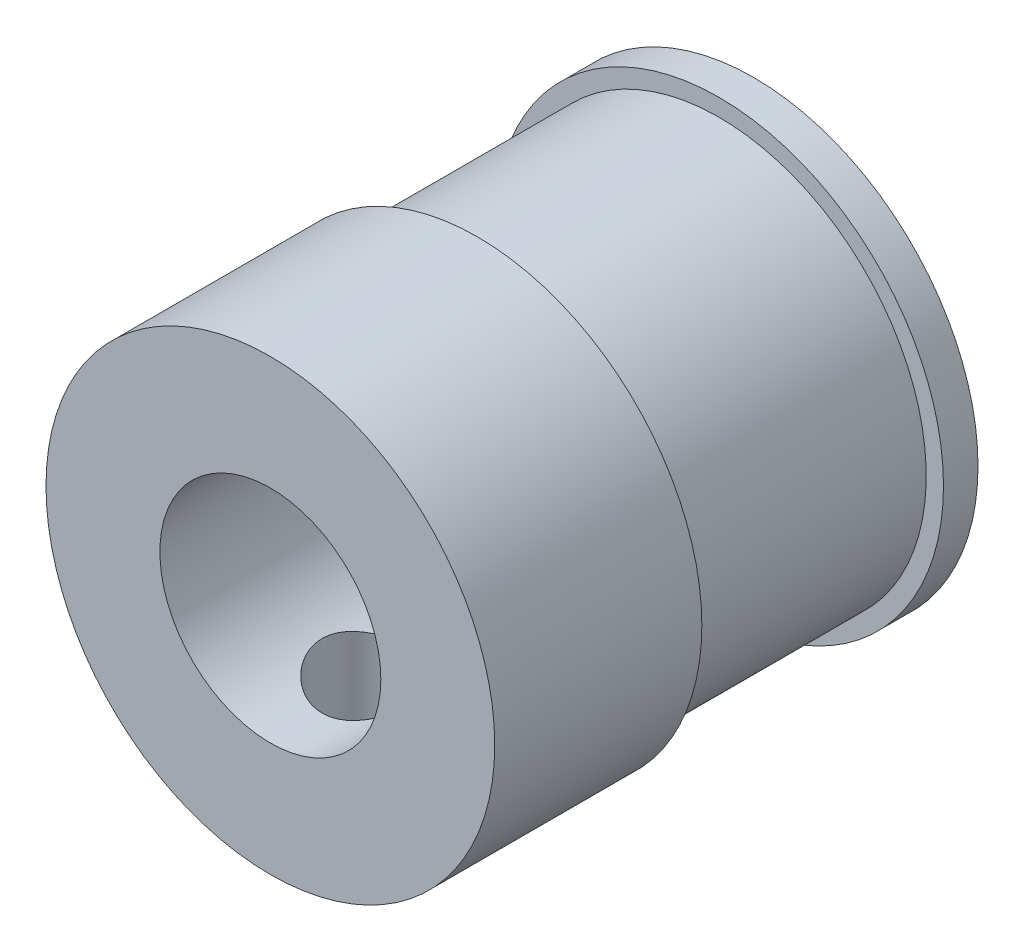
ISO-10303-21;
HEADER;
FILE_DESCRIPTION(('STEP AP214'),'2;1');
FILE_NAME('part.step','',(''),(''),'','','');
FILE_SCHEMA(('AUTOMOTIVE_DESIGN { 1 0 10303 214 1 1 1 1 }'));
ENDSEC;
DATA;
#1=APPLICATION_CONTEXT('core data for automotive mechanical design processes');
#2=APPLICATION_PROTOCOL_DEFINITION('international standard','automotive_design',2000,#1);
#3=PRODUCT_CONTEXT('',#1,'mechanical');
#4=PRODUCT('Part','Part','',(#3));
#5=PRODUCT_RELATED_PRODUCT_CATEGORY('part','',(#4));
#6=PRODUCT_DEFINITION_FORMATION('','',#4);
#7=PRODUCT_DEFINITION_CONTEXT('part definition',#1,'design');
#8=PRODUCT_DEFINITION('design','',#6,#7);
#9=PRODUCT_DEFINITION_SHAPE('','',#8);
#10=(LENGTH_UNIT() NAMED_UNIT(*) SI_UNIT(.MILLI.,.METRE.));
#11=(NAMED_UNIT(*) PLANE_ANGLE_UNIT() SI_UNIT($,.RADIAN.));
#12=(NAMED_UNIT(*) SI_UNIT($,.STERADIAN.) SOLID_ANGLE_UNIT());
#13=UNCERTAINTY_MEASURE_WITH_UNIT(LENGTH_MEASURE(1.E-05),#10,'distance_accuracy_value','');
#14=(GEOMETRIC_REPRESENTATION_CONTEXT(3) GLOBAL_UNCERTAINTY_ASSIGNED_CONTEXT((#13)) GLOBAL_UNIT_ASSIGNED_CONTEXT((#10,
#11,#12)) REPRESENTATION_CONTEXT('',''));
#15=CARTESIAN_POINT('',(0.,0.,0.));
#16=DIRECTION('',(0.,0.,1.));
#17=DIRECTION('',(1.,0.,0.));
#18=AXIS2_PLACEMENT_3D('',#15,#16,#17);
#19=CARTESIAN_POINT('',(0.,0.,14.));
#20=DIRECTION('',(0.,0.,-1.));
#21=DIRECTION('',(-1.,0.,0.));
#22=AXIS2_PLACEMENT_3D('',#19,#20,#21);
#23=CYLINDRICAL_SURFACE('',#22,6.5);
#24=CARTESIAN_POINT('',(0.,-6.5,12.5));
#25=CARTESIAN_POINT('',(0.0830761724763343,-6.49999849532867,12.4999973346441));
#26=CARTESIAN_POINT('',(0.166183602986827,-6.49839124214547,12.4930750731889));
#27=CARTESIAN_POINT('',(0.330029933246627,-6.49213500375529,12.4656023571143));
#28=CARTESIAN_POINT('',(0.410767233683362,-6.48748401185166,12.4450429115586));
#29=CARTESIAN_POINT('',(0.567482400649438,-6.47565710646771,12.3909803010591));
#30=CARTESIAN_POINT('',(0.643465410431956,-6.46848397910972,12.3574914148687));
#31=CARTESIAN_POINT('',(0.7887329552805,-6.45238316831829,12.2785677349316));
#32=CARTESIAN_POINT('',(0.858017512835939,-6.44345549077589,12.2331329812941));
#33=CARTESIAN_POINT('',(0.989152353123208,-6.42464323305021,12.1307547483228));
#34=CARTESIAN_POINT('',(1.05086679216121,-6.41474568654138,12.0736396382975));
#35=CARTESIAN_POINT('',(1.16393060397695,-6.39519859507266,11.9498900734287));
#36=CARTESIAN_POINT('',(1.2152789664991,-6.38554907436474,11.8832546918395));
#37=CARTESIAN_POINT('',(1.3067669575256,-6.36746174180576,11.7413330724397));
#38=CARTESIAN_POINT('',(1.34675925477788,-6.35904049089481,11.6659495590232));
#39=CARTESIAN_POINT('',(1.41345395330062,-6.34455046029963,11.5093049013494));
#40=CARTESIAN_POINT('',(1.44015813854148,-6.33848136485541,11.4280445477549));
#41=CARTESIAN_POINT('',(1.4790642425856,-6.32951534623235,11.2634341984173));
#42=CARTESIAN_POINT('',(1.49150809496879,-6.32656557105072,11.1801443266252));
#43=CARTESIAN_POINT('',(1.50229307046533,-6.32401364937952,11.0126109129544));
#44=CARTESIAN_POINT('',(1.50063613156308,-6.32441104286173,10.9283675037172));
#45=CARTESIAN_POINT('',(1.48346063285703,-6.32846083321139,10.7631371921762));
#46=CARTESIAN_POINT('',(1.46822575315178,-6.33204661249556,10.6821189186561));
#47=CARTESIAN_POINT('',(1.42477741479348,-6.34196351386388,10.5238202080984));
#48=CARTESIAN_POINT('',(1.39656315462671,-6.34829480548987,10.4465400022229));
#49=CARTESIAN_POINT('',(1.32770349075046,-6.36305332227188,10.2971273283591));
#50=CARTESIAN_POINT('',(1.28695129246528,-6.37149843240945,10.225045919089));
#51=CARTESIAN_POINT('',(1.19424748975255,-6.38952239681953,10.0886407637106));
#52=CARTESIAN_POINT('',(1.1422941964553,-6.39910142196225,10.024318189741));
#53=CARTESIAN_POINT('',(1.02717321086453,-6.41859777640793,9.90362604994903));
#54=CARTESIAN_POINT('',(0.963764950845053,-6.42851768847713,9.84748611487504));
#55=CARTESIAN_POINT('',(0.828318641053405,-6.44736816069401,9.74659692902464));
#56=CARTESIAN_POINT('',(0.75628039874503,-6.45629869876005,9.70184793245142));
#57=CARTESIAN_POINT('',(0.605321277972372,-6.47219854082994,9.62494408585668));
#58=CARTESIAN_POINT('',(0.52638314329425,-6.47916273202417,9.59282198430733));
#59=CARTESIAN_POINT('',(0.364032396252585,-6.49030757986402,9.54236385630495));
#60=CARTESIAN_POINT('',(0.280620512374239,-6.49448868821629,9.52402559261153));
#61=CARTESIAN_POINT('',(0.113657323931641,-6.49953102945198,9.50199584965185));
#62=CARTESIAN_POINT('',(0.0301494450127294,-6.50046326526885,9.49799106394027));
#63=CARTESIAN_POINT('',(-0.136342371579224,-6.49910299913129,9.50388901475928));
#64=CARTESIAN_POINT('',(-0.219326348562745,-6.49681074208307,9.513790695068));
#65=CARTESIAN_POINT('',(-0.381357903798023,-6.48930412349636,9.54696119660577));
#66=CARTESIAN_POINT('',(-0.460441464875699,-6.48412623941868,9.57006324131714));
#67=CARTESIAN_POINT('',(-0.613609622481663,-6.47142910428788,9.62879158892437));
#68=CARTESIAN_POINT('',(-0.687693760726586,-6.4639096389422,9.66441903813585));
#69=CARTESIAN_POINT('',(-0.830037615110186,-6.44718996088191,9.74782264392098));
#70=CARTESIAN_POINT('',(-0.898188410296325,-6.43796535296184,9.79577969188519));
#71=CARTESIAN_POINT('',(-1.02558718048178,-6.41890391913982,9.90224561735856));
#72=CARTESIAN_POINT('',(-1.08483385664762,-6.40906700421673,9.96075603154156));
#73=CARTESIAN_POINT('',(-1.19400102833017,-6.38964047483402,10.088112385879));
#74=CARTESIAN_POINT('',(-1.24370343589042,-6.3800601750374,10.1571469646774));
#75=CARTESIAN_POINT('',(-1.33081235446409,-6.36246188496285,10.3027658802153));
#76=CARTESIAN_POINT('',(-1.3682194122462,-6.35444382521927,10.3793498810384));
#77=CARTESIAN_POINT('',(-1.42941066868129,-6.34095951164845,10.5374759884225));
#78=CARTESIAN_POINT('',(-1.45327404481082,-6.33547846174878,10.6189861296834));
#79=CARTESIAN_POINT('',(-1.48692530676327,-6.3276660054956,10.7850039928478));
#80=CARTESIAN_POINT('',(-1.49671574099563,-6.32533402889437,10.86951116919));
#81=CARTESIAN_POINT('',(-1.50182536015786,-6.32412253425542,11.0369182270526));
#82=CARTESIAN_POINT('',(-1.49749127871471,-6.32516029248235,11.1198071106486));
#83=CARTESIAN_POINT('',(-1.47525685980881,-6.33038270361014,11.2836386786682));
#84=CARTESIAN_POINT('',(-1.45735672124419,-6.33456731037362,11.3645813916076));
#85=CARTESIAN_POINT('',(-1.40867420720143,-6.34556939165105,11.5219099107911));
#86=CARTESIAN_POINT('',(-1.37794771033572,-6.35237543592818,11.5983138607059));
#87=CARTESIAN_POINT('',(-1.304530822271,-6.36785683112448,11.7449318065413));
#88=CARTESIAN_POINT('',(-1.26183902581514,-6.37653240158127,11.8151450741274));
#89=CARTESIAN_POINT('',(-1.16457679516263,-6.39501829374307,11.9490855285901));
#90=CARTESIAN_POINT('',(-1.10976162033288,-6.4048496868242,12.0126321195496));
#91=CARTESIAN_POINT('',(-0.990297714593213,-6.42440402438128,12.1297382476383));
#92=CARTESIAN_POINT('',(-0.925646696024382,-6.43412694306169,12.1832954549303));
#93=CARTESIAN_POINT('',(-0.787191932761556,-6.45253999299533,12.2796672679488));
#94=CARTESIAN_POINT('',(-0.713266869084889,-6.46121270567525,12.3223111182898));
#95=CARTESIAN_POINT('',(-0.55910964147537,-6.47637045552876,12.3944991494086));
#96=CARTESIAN_POINT('',(-0.478882547101935,-6.48285722936411,12.4240537351029));
#97=CARTESIAN_POINT('',(-0.332210374198768,-6.49182723396727,12.4642784735557));
#98=CARTESIAN_POINT('',(-0.266526367321008,-6.49487228966801,12.477647271027));
#99=CARTESIAN_POINT('',(-0.133901630280835,-6.4989592245111,12.4955088666147));
#100=CARTESIAN_POINT('',(-0.0669609687898304,-6.5000012127936,12.5000021483273));
#101=CARTESIAN_POINT('',(0.,-6.5,12.5));
#102=B_SPLINE_CURVE_WITH_KNOTS('',3,(#24,#25,#26,#27,#28,#29,#30,#31,#32,#33,#34,#35,#36,#37,
#38,#39,#40,#41,#42,#43,#44,#45,#46,#47,#48,#49,#50,#51,#52,#53,#54,#55,#56,#57,#58,#59,#60,#61,
#62,#63,#64,#65,#66,#67,#68,#69,#70,#71,#72,#73,#74,#75,#76,#77,#78,#79,#80,#81,#82,#83,#84,#85,
#86,#87,#88,#89,#90,#91,#92,#93,#94,#95,#96,#97,#98,#99,#100,#101),.UNSPECIFIED.,.T.,.F.,(4,2,2,
2,2,2,2,2,2,2,2,2,2,2,2,2,2,2,2,2,2,2,2,2,2,2,2,2,2,2,2,2,2,2,2,2,2,2,4),(0.,0.248983311217114,
0.498130939431098,0.747004202472745,0.995876629917201,1.24870930222222,1.50156660317464,
1.7575684010941,2.0135358206962,2.26509316141456,2.51661592915602,2.76300377758328,
3.00940684320484,3.25796969712265,3.50657005489342,3.7611752627951,4.01578615203542,
4.27105309773002,4.52627860236005,4.77589001432915,5.02548246887371,5.27198911757477,
5.51851833225481,5.76889433751052,6.01930682944867,6.27489540554877,6.53047261420161,
6.7845398863154,7.03856114466416,7.28639401438665,7.53422325058917,7.7809838930653,
8.02777352833801,8.28009323709706,8.53247172133002,8.78858609727296,9.04449651578221,
9.24519271684376,9.44587798236134),.UNSPECIFIED.);
#103=CARTESIAN_POINT('',(0.,-6.5,12.5));
#104=VERTEX_POINT('',#103);
#105=EDGE_CURVE('E68',#104,#104,#102,.T.);
#106=ORIENTED_EDGE('',*,*,#105,.T.);
#107=EDGE_LOOP('',(#106));
#108=FACE_BOUND('',#107,.T.);
#109=CARTESIAN_POINT('',(0.,0.,14.));
#110=DIRECTION('',(0.,0.,1.));
#111=DIRECTION('',(1.,0.,0.));
#112=AXIS2_PLACEMENT_3D('',#109,#110,#111);
#113=CIRCLE('',#112,6.5);
#114=CARTESIAN_POINT('',(6.5,0.,14.));
#115=VERTEX_POINT('',#114);
#116=EDGE_CURVE('E10',#115,#115,#113,.T.);
#117=ORIENTED_EDGE('',*,*,#116,.F.);
#118=EDGE_LOOP('',(#117));
#119=FACE_BOUND('',#118,.T.);
#120=CARTESIAN_POINT('',(0.,0.,8.));
#121=DIRECTION('',(0.,0.,-1.));
#122=DIRECTION('',(-1.,0.,0.));
#123=AXIS2_PLACEMENT_3D('',#120,#121,#122);
#124=CIRCLE('',#123,6.5);
#125=CARTESIAN_POINT('',(-6.5,0.,8.));
#126=VERTEX_POINT('',#125);
#127=EDGE_CURVE('E56',#126,#126,#124,.T.);
#128=ORIENTED_EDGE('',*,*,#127,.F.);
#129=EDGE_LOOP('',(#128));
#130=FACE_BOUND('',#129,.T.);
#131=ADVANCED_FACE('F33',(#108,#119,#130),#23,.T.);
#132=CARTESIAN_POINT('',(0.,0.,1.));
#133=DIRECTION('',(0.,0.,-1.));
#134=DIRECTION('',(-1.,0.,0.));
#135=AXIS2_PLACEMENT_3D('',#132,#133,#134);
#136=CIRCLE('',#135,6.5);
#137=CARTESIAN_POINT('',(-6.5,0.,1.));
#138=VERTEX_POINT('',#137);
#139=EDGE_CURVE('E59',#138,#138,#136,.T.);
#140=ORIENTED_EDGE('',*,*,#139,.T.);
#141=EDGE_LOOP('',(#140));
#142=FACE_BOUND('',#141,.T.);
#143=CARTESIAN_POINT('',(0.,0.,0.));
#144=DIRECTION('',(0.,0.,1.));
#145=DIRECTION('',(1.,0.,0.));
#146=AXIS2_PLACEMENT_3D('',#143,#144,#145);
#147=CIRCLE('',#146,6.5);
#148=CARTESIAN_POINT('',(6.5,0.,0.));
#149=VERTEX_POINT('',#148);
#150=EDGE_CURVE('E46',#149,#149,#147,.T.);
#151=ORIENTED_EDGE('',*,*,#150,.T.);
#152=EDGE_LOOP('',(#151));
#153=FACE_BOUND('',#152,.T.);
#154=ADVANCED_FACE('F35',(#142,#153),#23,.T.);
#155=CARTESIAN_POINT('',(0.,0.,14.));
#156=DIRECTION('',(0.,0.,1.));
#157=DIRECTION('',(1.,0.,0.));
#158=AXIS2_PLACEMENT_3D('',#155,#156,#157);
#159=PLANE('',#158);
#160=CARTESIAN_POINT('',(0.,0.,14.));
#161=DIRECTION('',(0.,0.,1.));
#162=DIRECTION('',(1.,0.,0.));
#163=AXIS2_PLACEMENT_3D('',#160,#161,#162);
#164=CIRCLE('',#163,3.2);
#165=CARTESIAN_POINT('',(3.2,0.,14.));
#166=VERTEX_POINT('',#165);
#167=EDGE_CURVE('E53',#166,#166,#164,.T.);
#168=ORIENTED_EDGE('',*,*,#167,.F.);
#169=EDGE_LOOP('',(#168));
#170=FACE_BOUND('',#169,.T.);
#171=ORIENTED_EDGE('',*,*,#116,.T.);
#172=EDGE_LOOP('',(#171));
#173=FACE_BOUND('',#172,.T.);
#174=ADVANCED_FACE('F97',(#170,#173),#159,.T.);
#175=CARTESIAN_POINT('',(0.,0.,0.));
#176=DIRECTION('',(0.,0.,1.));
#177=DIRECTION('',(1.,0.,0.));
#178=AXIS2_PLACEMENT_3D('',#175,#176,#177);
#179=PLANE('',#178);
#180=CARTESIAN_POINT('',(0.,0.,0.));
#181=DIRECTION('',(0.,0.,1.));
#182=DIRECTION('',(1.,0.,0.));
#183=AXIS2_PLACEMENT_3D('',#180,#181,#182);
#184=CIRCLE('',#183,3.2);
#185=CARTESIAN_POINT('',(3.2,0.,0.));
#186=VERTEX_POINT('',#185);
#187=EDGE_CURVE('E51',#186,#186,#184,.T.);
#188=ORIENTED_EDGE('',*,*,#187,.T.);
#189=EDGE_LOOP('',(#188));
#190=FACE_BOUND('',#189,.T.);
#191=ORIENTED_EDGE('',*,*,#150,.F.);
#192=EDGE_LOOP('',(#191));
#193=FACE_BOUND('',#192,.T.);
#194=ADVANCED_FACE('F95',(#190,#193),#179,.F.);
#195=CARTESIAN_POINT('',(0.,0.,0.));
#196=DIRECTION('',(0.,0.,1.));
#197=DIRECTION('',(1.,0.,0.));
#198=AXIS2_PLACEMENT_3D('',#195,#196,#197);
#199=CYLINDRICAL_SURFACE('',#198,3.2);
#200=CARTESIAN_POINT('',(0.,-3.2,12.5));
#201=CARTESIAN_POINT('',(-0.0794366297653684,-3.19999630571425,12.4999956105829));
#202=CARTESIAN_POINT('',(-0.158985054285573,-3.19700957899868,12.4936526432925));
#203=CARTESIAN_POINT('',(-0.315767144342182,-3.18535757334793,12.4685442516593));
#204=CARTESIAN_POINT('',(-0.392995334806226,-3.17667982118131,12.449751539829));
#205=CARTESIAN_POINT('',(-0.542623613933924,-3.15456154654934,12.4006198880662));
#206=CARTESIAN_POINT('',(-0.615040476822122,-3.14113872828529,12.3703238372491));
#207=CARTESIAN_POINT('',(-0.753673316550171,-3.11079077785621,12.2992496399022));
#208=CARTESIAN_POINT('',(-0.819890295729099,-3.09386621324576,12.2584731917509));
#209=CARTESIAN_POINT('',(-0.948350357177736,-3.0570148530726,12.1650249277608));
#210=CARTESIAN_POINT('',(-1.01017369872326,-3.03697404361317,12.1118216432957));
#211=CARTESIAN_POINT('',(-1.12439785354931,-2.99656590387074,11.9961641953044));
#212=CARTESIAN_POINT('',(-1.17679240559473,-2.97619836632648,11.933703934463));
#213=CARTESIAN_POINT('',(-1.27411857201607,-2.93591183357015,11.7963434071221));
#214=CARTESIAN_POINT('',(-1.31833010930722,-2.91611100881908,11.7208943837464));
#215=CARTESIAN_POINT('',(-1.39325151163875,-2.88107150479241,11.562587259413));
#216=CARTESIAN_POINT('',(-1.4239700636606,-2.86582989225174,11.47973396691));
#217=CARTESIAN_POINT('',(-1.46919263785962,-2.84290120635756,11.3137612794281));
#218=CARTESIAN_POINT('',(-1.48450988794257,-2.83483816808474,11.2309177721529));
#219=CARTESIAN_POINT('',(-1.50101060360856,-2.82613943112327,11.0634755266261));
#220=CARTESIAN_POINT('',(-1.50220525058387,-2.82549785659326,10.9788782300868));
#221=CARTESIAN_POINT('',(-1.49102860152934,-2.83140540410836,10.8195723747177));
#222=CARTESIAN_POINT('',(-1.48002746065053,-2.83722835518323,10.7447346838905));
#223=CARTESIAN_POINT('',(-1.44711565103968,-2.85415400915747,10.5981251446924));
#224=CARTESIAN_POINT('',(-1.42520214213451,-2.86525808654715,10.5263540997636));
#225=CARTESIAN_POINT('',(-1.37065958454468,-2.89175132581127,10.3859141522109));
#226=CARTESIAN_POINT('',(-1.33779469146436,-2.90723355127044,10.3173552125722));
#227=CARTESIAN_POINT('',(-1.26245573982023,-2.94073170962085,10.186416964084));
#228=CARTESIAN_POINT('',(-1.21997747050552,-2.95874875147367,10.124040380433));
#229=CARTESIAN_POINT('',(-1.12117144504836,-2.99768064068318,10.0000360348979));
#230=CARTESIAN_POINT('',(-1.06383576537821,-3.01869659998739,9.93924049772552));
#231=CARTESIAN_POINT('',(-0.939641687550933,-3.05963196112561,9.8278067269063));
#232=CARTESIAN_POINT('',(-0.872779758723929,-3.07955095258331,9.77717227604926));
#233=CARTESIAN_POINT('',(-0.72832397791819,-3.11693783151282,9.68580670678833));
#234=CARTESIAN_POINT('',(-0.650429064841609,-3.13429076469825,9.64550086650323));
#235=CARTESIAN_POINT('',(-0.48794222779418,-3.16365420400246,9.57887112910029));
#236=CARTESIAN_POINT('',(-0.403355047372973,-3.1756684549702,9.55253742862182));
#237=CARTESIAN_POINT('',(-0.236758036703878,-3.19224313378799,9.51654123334738));
#238=CARTESIAN_POINT('',(-0.155037856315182,-3.19729898462949,9.50576759698721));
#239=CARTESIAN_POINT('',(0.0091952880939742,-3.20103907716323,9.49777950822713));
#240=CARTESIAN_POINT('',(0.0917079278381507,-3.199725822791,9.50055972729755));
#241=CARTESIAN_POINT('',(0.249398024817891,-3.19117976213987,9.51889078863891));
#242=CARTESIAN_POINT('',(0.324699508933728,-3.18434450990737,9.53358419440894));
#243=CARTESIAN_POINT('',(0.471643871417134,-3.16591825802244,9.57404010019741));
#244=CARTESIAN_POINT('',(0.543286322002911,-3.15432670372993,9.59980389116791));
#245=CARTESIAN_POINT('',(0.683383574707803,-3.12701756569302,9.66244402659857));
#246=CARTESIAN_POINT('',(0.751674047016101,-3.11118471264979,9.69963591888514));
#247=CARTESIAN_POINT('',(0.88128616247221,-3.07698472270414,9.78373121963596));
#248=CARTESIAN_POINT('',(0.94260472604946,-3.05861647375887,9.83063889405607));
#249=CARTESIAN_POINT('',(1.06226746295268,-3.01925452981606,9.93765018660463));
#250=CARTESIAN_POINT('',(1.11986840035393,-2.99817233580377,9.99855416111092));
#251=CARTESIAN_POINT('',(1.22431969123982,-2.95705916335382,10.1293394865031));
#252=CARTESIAN_POINT('',(1.27116477824616,-2.93702870357223,10.1992252091888));
#253=CARTESIAN_POINT('',(1.35418065576862,-2.89971388021076,10.3490279572482));
#254=CARTESIAN_POINT('',(1.38994353105744,-2.88254332558056,10.4292017300856));
#255=CARTESIAN_POINT('',(1.4470971383464,-2.85428508393637,10.5955032981221));
#256=CARTESIAN_POINT('',(1.46850394342155,-2.84319059671076,10.6816243151755));
#257=CARTESIAN_POINT('',(1.49455896187422,-2.82957416856734,10.8489905954208));
#258=CARTESIAN_POINT('',(1.50054972888926,-2.82636665307332,10.929970739588));
#259=CARTESIAN_POINT('',(1.49937130319663,-2.82699286139304,11.0917963082829));
#260=CARTESIAN_POINT('',(1.49220590575928,-2.83082455454675,11.1726417649312));
#261=CARTESIAN_POINT('',(1.46613131656595,-2.84440619852351,11.3256303053175));
#262=CARTESIAN_POINT('',(1.44813274734754,-2.85369602866639,11.3979740549795));
#263=CARTESIAN_POINT('',(1.40193210541393,-2.87667309849877,11.538578312548));
#264=CARTESIAN_POINT('',(1.37372698279688,-2.89036165246904,11.6068375928292));
#265=CARTESIAN_POINT('',(1.30578840174151,-2.92171219398703,11.7423181678849));
#266=CARTESIAN_POINT('',(1.26541393094301,-2.93957763369422,11.8091697357933));
#267=CARTESIAN_POINT('',(1.17505974072646,-2.97684766005847,11.9355618374978));
#268=CARTESIAN_POINT('',(1.12507549698614,-2.99625296915541,11.99509890587));
#269=CARTESIAN_POINT('',(1.01093776241371,-3.03677948258486,12.1114406539838));
#270=CARTESIAN_POINT('',(0.945860595498028,-3.05787468390215,12.167352978272));
#271=CARTESIAN_POINT('',(0.806562992145147,-3.09753038570267,12.2676031950751));
#272=CARTESIAN_POINT('',(0.732338206421693,-3.11608967155914,12.3119355503386));
#273=CARTESIAN_POINT('',(0.576903485633841,-3.14856405697806,12.3873025546057));
#274=CARTESIAN_POINT('',(0.49572795580457,-3.16250053665866,12.4183986152204));
#275=CARTESIAN_POINT('',(0.328585281775291,-3.18419214255065,12.466130445569));
#276=CARTESIAN_POINT('',(0.242633177608916,-3.19196561184219,12.4828091394575));
#277=CARTESIAN_POINT('',(0.129990114749171,-3.19746509257475,12.4945850673244));
#278=CARTESIAN_POINT('',(0.104046547063509,-3.19841374704826,12.4966134225616));
#279=CARTESIAN_POINT('',(0.052072659255267,-3.19968181283614,12.4993216223633));
#280=CARTESIAN_POINT('',(0.0260423373483137,-3.20000121112686,12.5000014390172));
#281=CARTESIAN_POINT('',(0.,-3.2,12.5));
#282=B_SPLINE_CURVE_WITH_KNOTS('',3,(#200,#201,#202,#203,#204,#205,#206,#207,#208,#209,#210,
#211,#212,#213,#214,#215,#216,#217,#218,#219,#220,#221,#222,#223,#224,#225,#226,#227,#228,#229,
#230,#231,#232,#233,#234,#235,#236,#237,#238,#239,#240,#241,#242,#243,#244,#245,#246,#247,#248,
#249,#250,#251,#252,#253,#254,#255,#256,#257,#258,#259,#260,#261,#262,#263,#264,#265,#266,#267,
#268,#269,#270,#271,#272,#273,#274,#275,#276,#277,#278,#279,#280,#281),.UNSPECIFIED.,.T.,.F.,(4,
2,2,2,2,2,2,2,2,2,2,2,2,2,2,2,2,2,2,2,2,2,2,2,2,2,2,2,2,2,2,2,2,2,2,2,2,2,2,2,4),(0.,
0.238203501088987,0.476930834285988,0.714776698722001,0.95258404383098,1.20348916300413,
1.45456028706044,1.72218974999842,1.98964665571214,2.24209356207648,2.49434058339922,
2.72088002998001,2.94747846905439,3.17931153510989,3.41124634347932,3.6686152967309,
3.92607988679166,4.1928727405001,4.45947815428198,4.70590077523508,4.95222652601424,
5.18224856612757,5.41229743710968,5.64937682702354,5.88656053405105,6.14473054024122,
6.40302668810358,6.66993374182532,6.93654146493568,7.1789957704764,7.4213801441569,
7.64578370611674,7.87025437934697,8.1096266208682,8.34911183707249,8.6129314932358,
8.87687707137173,9.13958432454605,9.40150671085486,9.47959722860009,9.55768936255934),.UNSPECIFIED.);
#283=CARTESIAN_POINT('',(0.,-3.2,12.5));
#284=VERTEX_POINT('',#283);
#285=EDGE_CURVE('E38',#284,#284,#282,.T.);
#286=ORIENTED_EDGE('',*,*,#285,.T.);
#287=EDGE_LOOP('',(#286));
#288=FACE_BOUND('',#287,.T.);
#289=ORIENTED_EDGE('',*,*,#187,.F.);
#290=EDGE_LOOP('',(#289));
#291=FACE_BOUND('',#290,.T.);
#292=ORIENTED_EDGE('',*,*,#167,.T.);
#293=EDGE_LOOP('',(#292));
#294=FACE_BOUND('',#293,.T.);
#295=ADVANCED_FACE('F88',(#288,#291,#294),#199,.F.);
#296=CARTESIAN_POINT('',(0.,0.,8.));
#297=DIRECTION('',(0.,0.,-1.));
#298=DIRECTION('',(-1.,0.,0.));
#299=AXIS2_PLACEMENT_3D('',#296,#297,#298);
#300=PLANE('',#299);
#301=CARTESIAN_POINT('',(0.,0.,8.));
#302=DIRECTION('',(0.,0.,-1.));
#303=DIRECTION('',(-1.,0.,0.));
#304=AXIS2_PLACEMENT_3D('',#301,#302,#303);
#305=CIRCLE('',#304,6.);
#306=CARTESIAN_POINT('',(-6.,0.,8.));
#307=VERTEX_POINT('',#306);
#308=EDGE_CURVE('E62',#307,#307,#305,.T.);
#309=ORIENTED_EDGE('',*,*,#308,.F.);
#310=EDGE_LOOP('',(#309));
#311=FACE_BOUND('',#310,.T.);
#312=ORIENTED_EDGE('',*,*,#127,.T.);
#313=EDGE_LOOP('',(#312));
#314=FACE_BOUND('',#313,.T.);
#315=ADVANCED_FACE('F85',(#311,#314),#300,.T.);
#316=CARTESIAN_POINT('',(0.,0.,1.));
#317=DIRECTION('',(0.,0.,-1.));
#318=DIRECTION('',(-1.,0.,0.));
#319=AXIS2_PLACEMENT_3D('',#316,#317,#318);
#320=PLANE('',#319);
#321=CARTESIAN_POINT('',(0.,0.,1.));
#322=DIRECTION('',(0.,0.,-1.));
#323=DIRECTION('',(-1.,0.,0.));
#324=AXIS2_PLACEMENT_3D('',#321,#322,#323);
#325=CIRCLE('',#324,6.);
#326=CARTESIAN_POINT('',(-6.,0.,1.));
#327=VERTEX_POINT('',#326);
#328=EDGE_CURVE('E65',#327,#327,#325,.T.);
#329=ORIENTED_EDGE('',*,*,#328,.T.);
#330=EDGE_LOOP('',(#329));
#331=FACE_BOUND('',#330,.T.);
#332=ORIENTED_EDGE('',*,*,#139,.F.);
#333=EDGE_LOOP('',(#332));
#334=FACE_BOUND('',#333,.T.);
#335=ADVANCED_FACE('F83',(#331,#334),#320,.F.);
#336=CARTESIAN_POINT('',(0.,0.,8.));
#337=DIRECTION('',(0.,0.,-1.));
#338=DIRECTION('',(-1.,0.,0.));
#339=AXIS2_PLACEMENT_3D('',#336,#337,#338);
#340=CYLINDRICAL_SURFACE('',#339,6.);
#341=ORIENTED_EDGE('',*,*,#308,.T.);
#342=EDGE_LOOP('',(#341));
#343=FACE_BOUND('',#342,.T.);
#344=ORIENTED_EDGE('',*,*,#328,.F.);
#345=EDGE_LOOP('',(#344));
#346=FACE_BOUND('',#345,.T.);
#347=ADVANCED_FACE('F78',(#343,#346),#340,.T.);
#348=CARTESIAN_POINT('',(0.,-7.,11.));
#349=DIRECTION('',(0.,1.,0.));
#350=DIRECTION('',(0.,0.,1.));
#351=AXIS2_PLACEMENT_3D('',#348,#349,#350);
#352=CYLINDRICAL_SURFACE('',#351,1.5);
#353=ORIENTED_EDGE('',*,*,#285,.F.);
#354=EDGE_LOOP('',(#353));
#355=FACE_BOUND('',#354,.T.);
#356=ORIENTED_EDGE('',*,*,#105,.F.);
#357=EDGE_LOOP('',(#356));
#358=FACE_BOUND('',#357,.T.);
#359=ADVANCED_FACE('F74',(#355,#358),#352,.F.);
#360=CLOSED_SHELL('',(#131,#154,#174,#194,#295,#315,#335,#347,#359));
#361=MANIFOLD_SOLID_BREP('B2',#360);
#362=ADVANCED_BREP_SHAPE_REPRESENTATION('',(#18,#361),#14);
#363=SHAPE_DEFINITION_REPRESENTATION(#9,#362);
ENDSEC;
END-ISO-10303-21;
